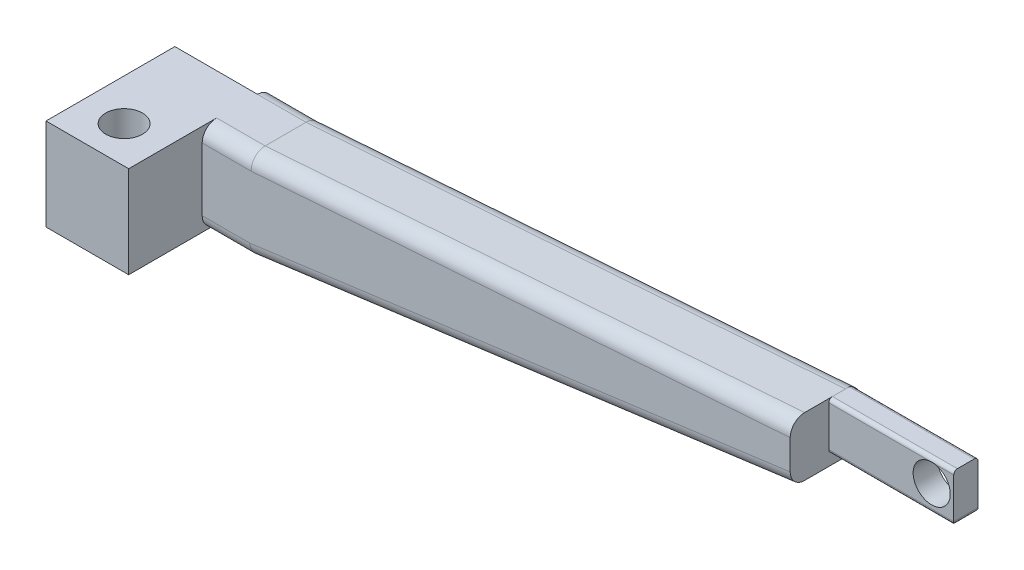
ISO-10303-21;
HEADER;
FILE_DESCRIPTION(('STEP AP214'),'2;1');
FILE_NAME('part.step','',(''),(''),'','','');
FILE_SCHEMA(('AUTOMOTIVE_DESIGN { 1 0 10303 214 1 1 1 1 }'));
ENDSEC;
DATA;
#1=APPLICATION_CONTEXT('core data for automotive mechanical design processes');
#2=APPLICATION_PROTOCOL_DEFINITION('international standard','automotive_design',2000,#1);
#3=PRODUCT_CONTEXT('',#1,'mechanical');
#4=PRODUCT('Part','Part','',(#3));
#5=PRODUCT_RELATED_PRODUCT_CATEGORY('part','',(#4));
#6=PRODUCT_DEFINITION_FORMATION('','',#4);
#7=PRODUCT_DEFINITION_CONTEXT('part definition',#1,'design');
#8=PRODUCT_DEFINITION('design','',#6,#7);
#9=PRODUCT_DEFINITION_SHAPE('','',#8);
#10=(LENGTH_UNIT() NAMED_UNIT(*) SI_UNIT(.MILLI.,.METRE.));
#11=(NAMED_UNIT(*) PLANE_ANGLE_UNIT() SI_UNIT($,.RADIAN.));
#12=(NAMED_UNIT(*) SI_UNIT($,.STERADIAN.) SOLID_ANGLE_UNIT());
#13=UNCERTAINTY_MEASURE_WITH_UNIT(LENGTH_MEASURE(1.E-05),#10,'distance_accuracy_value','');
#14=(GEOMETRIC_REPRESENTATION_CONTEXT(3) GLOBAL_UNCERTAINTY_ASSIGNED_CONTEXT((#13)) GLOBAL_UNIT_ASSIGNED_CONTEXT((#10,
#11,#12)) REPRESENTATION_CONTEXT('',''));
#15=CARTESIAN_POINT('',(0.,0.,0.));
#16=DIRECTION('',(0.,0.,1.));
#17=DIRECTION('',(1.,0.,0.));
#18=AXIS2_PLACEMENT_3D('',#15,#16,#17);
#19=CARTESIAN_POINT('',(406.4,-11.246281292,50.8));
#20=DIRECTION('',(-1.,0.,0.));
#21=DIRECTION('',(0.,0.,1.));
#22=AXIS2_PLACEMENT_3D('',#19,#20,#21);
#23=PLANE('',#22);
#24=DIRECTION('',(0.,-1.,0.));
#25=VECTOR('',#24,1.);
#26=CARTESIAN_POINT('',(406.4,90.353718708,72.39));
#27=LINE('',#26,#25);
#28=CARTESIAN_POINT('',(406.4,87.813718708,72.39));
#29=VERTEX_POINT('',#28);
#30=CARTESIAN_POINT('',(406.4,59.873718708,72.39));
#31=VERTEX_POINT('',#30);
#32=EDGE_CURVE('E488',#29,#31,#27,.T.);
#33=ORIENTED_EDGE('',*,*,#32,.F.);
#34=CARTESIAN_POINT('',(406.4,87.813718708,69.85));
#35=DIRECTION('',(-1.,0.,0.));
#36=DIRECTION('',(0.,0.,1.));
#37=AXIS2_PLACEMENT_3D('',#34,#35,#36);
#38=CIRCLE('',#37,2.54);
#39=CARTESIAN_POINT('',(406.4,90.353718708,69.85));
#40=VERTEX_POINT('',#39);
#41=EDGE_CURVE('E174',#29,#40,#38,.T.);
#42=ORIENTED_EDGE('',*,*,#41,.T.);
#43=DIRECTION('',(0.,0.,-1.));
#44=VECTOR('',#43,1.);
#45=CARTESIAN_POINT('',(406.4,90.353718708,99.06));
#46=LINE('',#45,#44);
#47=CARTESIAN_POINT('',(406.4,90.353718708,89.06));
#48=VERTEX_POINT('',#47);
#49=EDGE_CURVE('E182',#48,#40,#46,.T.);
#50=ORIENTED_EDGE('',*,*,#49,.F.);
#51=CARTESIAN_POINT('',(406.4,80.3278225001821,89.06));
#52=DIRECTION('',(-1.,0.,0.));
#53=DIRECTION('',(0.,1.,0.));
#54=AXIS2_PLACEMENT_3D('',#51,#52,#53);
#55=ELLIPSE('',#54,10.0258962078179,10.);
#56=CARTESIAN_POINT('',(406.4,80.3278225001821,99.06));
#57=VERTEX_POINT('',#56);
#58=EDGE_CURVE('E667',#48,#57,#55,.F.);
#59=ORIENTED_EDGE('',*,*,#58,.T.);
#60=DIRECTION('',(0.,-1.,0.));
#61=VECTOR('',#60,1.);
#62=CARTESIAN_POINT('',(406.4,0.,99.06));
#63=LINE('',#62,#61);
#64=CARTESIAN_POINT('',(406.4,59.8021945645248,99.06));
#65=VERTEX_POINT('',#64);
#66=EDGE_CURVE('E593',#57,#65,#63,.T.);
#67=ORIENTED_EDGE('',*,*,#66,.T.);
#68=CARTESIAN_POINT('',(406.4,59.8021945645248,89.06));
#69=DIRECTION('',(-1.,0.,0.));
#70=DIRECTION('',(0.,-1.,0.));
#71=AXIS2_PLACEMENT_3D('',#68,#69,#70);
#72=ELLIPSE('',#71,10.0884758565248,10.);
#73=CARTESIAN_POINT('',(406.4,49.713718708,89.06));
#74=VERTEX_POINT('',#73);
#75=EDGE_CURVE('E663',#65,#74,#72,.F.);
#76=ORIENTED_EDGE('',*,*,#75,.T.);
#77=DIRECTION('',(0.,0.,1.));
#78=VECTOR('',#77,1.);
#79=CARTESIAN_POINT('',(406.4,49.713718708,99.06));
#80=LINE('',#79,#78);
#81=CARTESIAN_POINT('',(406.4,49.713718708,60.8));
#82=VERTEX_POINT('',#81);
#83=EDGE_CURVE('E565',#82,#74,#80,.T.);
#84=ORIENTED_EDGE('',*,*,#83,.F.);
#85=CARTESIAN_POINT('',(406.4,59.8021945645248,60.8));
#86=DIRECTION('',(-1.,0.,0.));
#87=DIRECTION('',(0.,1.,0.));
#88=AXIS2_PLACEMENT_3D('',#85,#86,#87);
#89=ELLIPSE('',#88,10.0884758565248,10.);
#90=CARTESIAN_POINT('',(406.4,59.8021945645248,50.8));
#91=VERTEX_POINT('',#90);
#92=EDGE_CURVE('E628',#82,#91,#89,.F.);
#93=ORIENTED_EDGE('',*,*,#92,.T.);
#94=DIRECTION('',(0.,-1.,0.));
#95=VECTOR('',#94,1.);
#96=CARTESIAN_POINT('',(406.4,0.,50.8));
#97=LINE('',#96,#95);
#98=CARTESIAN_POINT('',(406.4,80.3278225001821,50.8));
#99=VERTEX_POINT('',#98);
#100=EDGE_CURVE('E586',#99,#91,#97,.T.);
#101=ORIENTED_EDGE('',*,*,#100,.F.);
#102=CARTESIAN_POINT('',(406.4,80.3278225001821,60.8));
#103=DIRECTION('',(-1.,0.,0.));
#104=DIRECTION('',(0.,-1.,0.));
#105=AXIS2_PLACEMENT_3D('',#102,#103,#104);
#106=ELLIPSE('',#105,10.0258962078179,10.);
#107=CARTESIAN_POINT('',(406.4,89.114687054896,55.9844681161223));
#108=VERTEX_POINT('',#107);
#109=EDGE_CURVE('E202',#99,#108,#106,.F.);
#110=ORIENTED_EDGE('',*,*,#109,.T.);
#111=CARTESIAN_POINT('',(406.4,87.813718708,58.166));
#112=DIRECTION('',(-1.,0.,0.));
#113=DIRECTION('',(0.,0.,1.));
#114=AXIS2_PLACEMENT_3D('',#111,#112,#113);
#115=CIRCLE('',#114,2.54);
#116=CARTESIAN_POINT('',(406.4,87.813718708,55.626));
#117=VERTEX_POINT('',#116);
#118=EDGE_CURVE('E455',#108,#117,#115,.T.);
#119=ORIENTED_EDGE('',*,*,#118,.T.);
#120=DIRECTION('',(0.,1.,0.));
#121=VECTOR('',#120,1.);
#122=CARTESIAN_POINT('',(406.4,90.353718708,55.626));
#123=LINE('',#122,#121);
#124=CARTESIAN_POINT('',(406.4,59.873718708,55.626));
#125=VERTEX_POINT('',#124);
#126=EDGE_CURVE('E252',#125,#117,#123,.T.);
#127=ORIENTED_EDGE('',*,*,#126,.F.);
#128=CARTESIAN_POINT('',(406.4,59.873718708,58.166));
#129=DIRECTION('',(-1.,0.,0.));
#130=DIRECTION('',(0.,0.,1.));
#131=AXIS2_PLACEMENT_3D('',#128,#129,#130);
#132=CIRCLE('',#131,2.54);
#133=CARTESIAN_POINT('',(406.4,57.333718708,58.166));
#134=VERTEX_POINT('',#133);
#135=EDGE_CURVE('E242',#125,#134,#132,.T.);
#136=ORIENTED_EDGE('',*,*,#135,.T.);
#137=DIRECTION('',(0.,0.,-1.));
#138=VECTOR('',#137,1.);
#139=CARTESIAN_POINT('',(406.4,57.333718708,55.626));
#140=LINE('',#139,#138);
#141=CARTESIAN_POINT('',(406.4,57.333718708,69.85));
#142=VERTEX_POINT('',#141);
#143=EDGE_CURVE('E481',#142,#134,#140,.T.);
#144=ORIENTED_EDGE('',*,*,#143,.F.);
#145=CARTESIAN_POINT('',(406.4,59.873718708,69.85));
#146=DIRECTION('',(-1.,0.,0.));
#147=DIRECTION('',(0.,0.,1.));
#148=AXIS2_PLACEMENT_3D('',#145,#146,#147);
#149=CIRCLE('',#148,2.54);
#150=EDGE_CURVE('E12',#142,#31,#149,.T.);
#151=ORIENTED_EDGE('',*,*,#150,.T.);
#152=EDGE_LOOP('',(#33,#42,#50,#59,#67,#76,#84,#93,#101,#110,#119,#127,#136,#144,#151));
#153=FACE_BOUND('',#152,.T.);
#154=ADVANCED_FACE('F163',(#153),#23,.F.);
#155=CARTESIAN_POINT('',(0.,63.5,50.8));
#156=DIRECTION('',(0.,-1.,0.));
#157=DIRECTION('',(1.,0.,0.));
#158=AXIS2_PLACEMENT_3D('',#155,#156,#157);
#159=PLANE('',#158);
#160=DIRECTION('',(-1.,0.,0.));
#161=VECTOR('',#160,1.);
#162=CARTESIAN_POINT('',(0.,63.5,60.8));
#163=LINE('',#162,#161);
#164=CARTESIAN_POINT('',(33.5017295109887,63.5,60.8));
#165=VERTEX_POINT('',#164);
#166=CARTESIAN_POINT('',(0.,63.5,60.8));
#167=VERTEX_POINT('',#166);
#168=EDGE_CURVE('E601',#165,#167,#163,.T.);
#169=ORIENTED_EDGE('',*,*,#168,.T.);
#170=DIRECTION('',(1.,0.,0.));
#171=VECTOR('',#170,1.);
#172=CARTESIAN_POINT('',(0.,63.5,60.8));
#173=LINE('',#172,#171);
#174=CARTESIAN_POINT('',(-57.15,63.5,60.8));
#175=VERTEX_POINT('',#174);
#176=EDGE_CURVE('E493',#175,#167,#173,.T.);
#177=ORIENTED_EDGE('',*,*,#176,.F.);
#178=DIRECTION('',(0.,0.,-1.));
#179=VECTOR('',#178,1.);
#180=CARTESIAN_POINT('',(-57.15,63.5,50.8));
#181=LINE('',#180,#179);
#182=CARTESIAN_POINT('',(-57.15,63.5,149.86));
#183=VERTEX_POINT('',#182);
#184=EDGE_CURVE('E582',#183,#175,#181,.T.);
#185=ORIENTED_EDGE('',*,*,#184,.F.);
#186=DIRECTION('',(1.,0.,0.));
#187=VECTOR('',#186,1.);
#188=CARTESIAN_POINT('',(-57.15,63.5,149.86));
#189=LINE('',#188,#187);
#190=CARTESIAN_POINT('',(0.,63.5,149.86));
#191=VERTEX_POINT('',#190);
#192=EDGE_CURVE('E535',#183,#191,#189,.T.);
#193=ORIENTED_EDGE('',*,*,#192,.T.);
#194=DIRECTION('',(0.,0.,-1.));
#195=VECTOR('',#194,1.);
#196=CARTESIAN_POINT('',(0.,63.5,50.8));
#197=LINE('',#196,#195);
#198=CARTESIAN_POINT('',(0.,63.5,89.06));
#199=VERTEX_POINT('',#198);
#200=EDGE_CURVE('E526',#191,#199,#197,.T.);
#201=ORIENTED_EDGE('',*,*,#200,.T.);
#202=DIRECTION('',(-1.,0.,0.));
#203=VECTOR('',#202,1.);
#204=CARTESIAN_POINT('',(33.5017295109887,63.5,89.06));
#205=LINE('',#204,#203);
#206=CARTESIAN_POINT('',(33.5017295109887,63.5,89.06));
#207=VERTEX_POINT('',#206);
#208=EDGE_CURVE('E597',#199,#207,#205,.F.);
#209=ORIENTED_EDGE('',*,*,#208,.T.);
#210=DIRECTION('',(0.,0.,-1.));
#211=VECTOR('',#210,1.);
#212=CARTESIAN_POINT('',(33.5017295109887,63.5,99.06));
#213=LINE('',#212,#211);
#214=EDGE_CURVE('E567',#207,#165,#213,.T.);
#215=ORIENTED_EDGE('',*,*,#214,.T.);
#216=EDGE_LOOP('',(#169,#177,#185,#193,#201,#209,#215));
#217=FACE_BOUND('',#216,.T.);
#218=CARTESIAN_POINT('',(-28.575,63.5,124.46));
#219=DIRECTION('',(0.,1.,0.));
#220=DIRECTION('',(-1.,0.,0.));
#221=AXIS2_PLACEMENT_3D('',#218,#219,#220);
#222=CIRCLE('',#221,12.7);
#223=CARTESIAN_POINT('',(-41.275,63.5,124.46));
#224=VERTEX_POINT('',#223);
#225=EDGE_CURVE('E521',#224,#224,#222,.T.);
#226=ORIENTED_EDGE('',*,*,#225,.F.);
#227=EDGE_LOOP('',(#226));
#228=FACE_BOUND('',#227,.T.);
#229=ADVANCED_FACE('F365',(#217,#228),#159,.F.);
#230=CARTESIAN_POINT('',(-57.15,0.,50.8));
#231=DIRECTION('',(1.,0.,0.));
#232=DIRECTION('',(0.,0.,-1.));
#233=AXIS2_PLACEMENT_3D('',#230,#231,#232);
#234=PLANE('',#233);
#235=ORIENTED_EDGE('',*,*,#184,.T.);
#236=DIRECTION('',(0.,-1.,0.));
#237=VECTOR('',#236,1.);
#238=CARTESIAN_POINT('',(-57.15,0.,60.8));
#239=LINE('',#238,#237);
#240=CARTESIAN_POINT('',(-57.15,0.,60.8));
#241=VERTEX_POINT('',#240);
#242=EDGE_CURVE('E517',#175,#241,#239,.T.);
#243=ORIENTED_EDGE('',*,*,#242,.T.);
#244=DIRECTION('',(0.,0.,-1.));
#245=VECTOR('',#244,1.);
#246=CARTESIAN_POINT('',(-57.15,0.,50.8));
#247=LINE('',#246,#245);
#248=CARTESIAN_POINT('',(-57.15,0.,149.86));
#249=VERTEX_POINT('',#248);
#250=EDGE_CURVE('E578',#249,#241,#247,.T.);
#251=ORIENTED_EDGE('',*,*,#250,.F.);
#252=DIRECTION('',(0.,1.,0.));
#253=VECTOR('',#252,1.);
#254=CARTESIAN_POINT('',(-57.15,0.,149.86));
#255=LINE('',#254,#253);
#256=EDGE_CURVE('E539',#249,#183,#255,.T.);
#257=ORIENTED_EDGE('',*,*,#256,.T.);
#258=EDGE_LOOP('',(#235,#243,#251,#257));
#259=FACE_BOUND('',#258,.T.);
#260=ADVANCED_FACE('F385',(#259),#234,.F.);
#261=CARTESIAN_POINT('',(0.,0.,50.8));
#262=DIRECTION('',(0.,1.,0.));
#263=DIRECTION('',(-1.,0.,0.));
#264=AXIS2_PLACEMENT_3D('',#261,#262,#263);
#265=PLANE('',#264);
#266=DIRECTION('',(1.,0.,0.));
#267=VECTOR('',#266,1.);
#268=CARTESIAN_POINT('',(0.,0.,60.8));
#269=LINE('',#268,#267);
#270=CARTESIAN_POINT('',(0.,0.,60.8));
#271=VERTEX_POINT('',#270);
#272=EDGE_CURVE('E506',#241,#271,#269,.T.);
#273=ORIENTED_EDGE('',*,*,#272,.T.);
#274=DIRECTION('',(0.,0.,-1.));
#275=VECTOR('',#274,1.);
#276=CARTESIAN_POINT('',(0.,0.,60.8));
#277=LINE('',#276,#275);
#278=CARTESIAN_POINT('',(0.,0.,52.4967645251728));
#279=VERTEX_POINT('',#278);
#280=EDGE_CURVE('E502',#271,#279,#277,.T.);
#281=ORIENTED_EDGE('',*,*,#280,.T.);
#282=CARTESIAN_POINT('',(-42.1710484774112,0.,60.8));
#283=DIRECTION('',(0.,1.,0.));
#284=DIRECTION('',(1.,0.,0.));
#285=AXIS2_PLACEMENT_3D('',#282,#283,#284);
#286=ELLIPSE('',#285,75.6727779884,10.);
#287=CARTESIAN_POINT('',(33.5017295109887,0.,60.8));
#288=VERTEX_POINT('',#287);
#289=EDGE_CURVE('E636',#279,#288,#286,.F.);
#290=ORIENTED_EDGE('',*,*,#289,.T.);
#291=DIRECTION('',(0.,0.,-1.));
#292=VECTOR('',#291,1.);
#293=CARTESIAN_POINT('',(33.5017295109887,0.,99.06));
#294=LINE('',#293,#292);
#295=CARTESIAN_POINT('',(33.5017295109887,0.,89.06));
#296=VERTEX_POINT('',#295);
#297=EDGE_CURVE('E573',#296,#288,#294,.T.);
#298=ORIENTED_EDGE('',*,*,#297,.F.);
#299=DIRECTION('',(1.,0.,0.));
#300=VECTOR('',#299,1.);
#301=CARTESIAN_POINT('',(-57.15,0.,89.06));
#302=LINE('',#301,#300);
#303=CARTESIAN_POINT('',(0.,0.,89.06));
#304=VERTEX_POINT('',#303);
#305=EDGE_CURVE('E632',#296,#304,#302,.F.);
#306=ORIENTED_EDGE('',*,*,#305,.T.);
#307=DIRECTION('',(0.,0.,-1.));
#308=VECTOR('',#307,1.);
#309=CARTESIAN_POINT('',(0.,0.,50.8));
#310=LINE('',#309,#308);
#311=CARTESIAN_POINT('',(0.,0.,149.86));
#312=VERTEX_POINT('',#311);
#313=EDGE_CURVE('E530',#312,#304,#310,.T.);
#314=ORIENTED_EDGE('',*,*,#313,.F.);
#315=DIRECTION('',(1.,0.,0.));
#316=VECTOR('',#315,1.);
#317=CARTESIAN_POINT('',(-57.15,0.,149.86));
#318=LINE('',#317,#316);
#319=EDGE_CURVE('E534',#249,#312,#318,.T.);
#320=ORIENTED_EDGE('',*,*,#319,.F.);
#321=ORIENTED_EDGE('',*,*,#250,.T.);
#322=EDGE_LOOP('',(#273,#281,#290,#298,#306,#314,#320,#321));
#323=FACE_BOUND('',#322,.T.);
#324=CARTESIAN_POINT('',(-28.575,0.,124.46));
#325=DIRECTION('',(0.,1.,0.));
#326=DIRECTION('',(-1.,0.,0.));
#327=AXIS2_PLACEMENT_3D('',#324,#325,#326);
#328=CIRCLE('',#327,12.7);
#329=CARTESIAN_POINT('',(-41.275,0.,124.46));
#330=VERTEX_POINT('',#329);
#331=EDGE_CURVE('E522',#330,#330,#328,.T.);
#332=ORIENTED_EDGE('',*,*,#331,.T.);
#333=EDGE_LOOP('',(#332));
#334=FACE_BOUND('',#333,.T.);
#335=ADVANCED_FACE('F381',(#323,#334),#265,.F.);
#336=CARTESIAN_POINT('',(33.5017295109887,0.,99.06));
#337=DIRECTION('',(-0.132147917201255,0.991230007606393,0.));
#338=DIRECTION('',(-0.991230007606393,-0.132147917201255,0.));
#339=AXIS2_PLACEMENT_3D('',#336,#337,#338);
#340=PLANE('',#339);
#341=ORIENTED_EDGE('',*,*,#297,.T.);
#342=DIRECTION('',(0.991230007606393,0.132147917201255,0.));
#343=VECTOR('',#342,1.);
#344=CARTESIAN_POINT('',(33.5017295109887,0.,60.8));
#345=LINE('',#344,#343);
#346=EDGE_CURVE('E621',#288,#82,#345,.T.);
#347=ORIENTED_EDGE('',*,*,#346,.T.);
#348=ORIENTED_EDGE('',*,*,#83,.T.);
#349=DIRECTION('',(0.991230007606393,0.132147917201255,0.));
#350=VECTOR('',#349,1.);
#351=CARTESIAN_POINT('',(33.5017295109887,0.,89.06));
#352=LINE('',#351,#350);
#353=EDGE_CURVE('E617',#74,#296,#352,.F.);
#354=ORIENTED_EDGE('',*,*,#353,.T.);
#355=EDGE_LOOP('',(#341,#347,#348,#354));
#356=FACE_BOUND('',#355,.T.);
#357=ADVANCED_FACE('F378',(#356),#340,.F.);
#358=CARTESIAN_POINT('',(33.5017295109887,63.5,99.06));
#359=DIRECTION('',(0.0718275183855872,-0.99741706803251,0.));
#360=DIRECTION('',(0.99741706803251,0.0718275183855872,0.));
#361=AXIS2_PLACEMENT_3D('',#358,#359,#360);
#362=PLANE('',#361);
#363=DIRECTION('',(0.,0.,1.));
#364=VECTOR('',#363,1.);
#365=CARTESIAN_POINT('',(406.4,90.353718708,50.8));
#366=LINE('',#365,#364);
#367=CARTESIAN_POINT('',(406.4,90.353718708,60.8));
#368=VERTEX_POINT('',#367);
#369=EDGE_CURVE('E562',#368,#40,#366,.T.);
#370=ORIENTED_EDGE('',*,*,#369,.F.);
#371=DIRECTION('',(-0.99741706803251,-0.0718275183855872,0.));
#372=VECTOR('',#371,1.);
#373=CARTESIAN_POINT('',(33.5017295109887,63.5,60.8));
#374=LINE('',#373,#372);
#375=EDGE_CURVE('E643',#368,#165,#374,.T.);
#376=ORIENTED_EDGE('',*,*,#375,.T.);
#377=ORIENTED_EDGE('',*,*,#214,.F.);
#378=DIRECTION('',(-0.99741706803251,-0.0718275183855872,0.));
#379=VECTOR('',#378,1.);
#380=CARTESIAN_POINT('',(406.4,90.353718708,89.06));
#381=LINE('',#380,#379);
#382=EDGE_CURVE('E640',#207,#48,#381,.F.);
#383=ORIENTED_EDGE('',*,*,#382,.T.);
#384=ORIENTED_EDGE('',*,*,#49,.T.);
#385=EDGE_LOOP('',(#370,#376,#377,#383,#384));
#386=FACE_BOUND('',#385,.T.);
#387=ADVANCED_FACE('F370',(#386),#362,.F.);
#388=CARTESIAN_POINT('',(0.,0.,99.06));
#389=DIRECTION('',(0.,0.,1.));
#390=DIRECTION('',(1.,0.,0.));
#391=AXIS2_PLACEMENT_3D('',#388,#389,#390);
#392=PLANE('',#391);
#393=DIRECTION('',(0.,1.,0.));
#394=VECTOR('',#393,1.);
#395=CARTESIAN_POINT('',(0.,0.,99.06));
#396=LINE('',#395,#394);
#397=CARTESIAN_POINT('',(0.,10.,99.06));
#398=VERTEX_POINT('',#397);
#399=CARTESIAN_POINT('',(0.,53.5,99.06));
#400=VERTEX_POINT('',#399);
#401=EDGE_CURVE('E550',#398,#400,#396,.T.);
#402=ORIENTED_EDGE('',*,*,#401,.F.);
#403=DIRECTION('',(1.,0.,0.));
#404=VECTOR('',#403,1.);
#405=CARTESIAN_POINT('',(33.5017295109887,10.,99.06));
#406=LINE('',#405,#404);
#407=CARTESIAN_POINT('',(32.8380798236274,10.,99.06));
#408=VERTEX_POINT('',#407);
#409=EDGE_CURVE('E655',#398,#408,#406,.T.);
#410=ORIENTED_EDGE('',*,*,#409,.T.);
#411=DIRECTION('',(0.991230007606393,0.132147917201255,0.));
#412=VECTOR('',#411,1.);
#413=CARTESIAN_POINT('',(405.078520827988,59.626018784064,99.06));
#414=LINE('',#413,#412);
#415=EDGE_CURVE('E659',#408,#65,#414,.T.);
#416=ORIENTED_EDGE('',*,*,#415,.T.);
#417=ORIENTED_EDGE('',*,*,#66,.F.);
#418=DIRECTION('',(-0.99741706803251,-0.0718275183855872,0.));
#419=VECTOR('',#418,1.);
#420=CARTESIAN_POINT('',(34.2200046948446,53.5258293196749,99.06));
#421=LINE('',#420,#419);
#422=CARTESIAN_POINT('',(33.8613315166746,53.5,99.06));
#423=VERTEX_POINT('',#422);
#424=EDGE_CURVE('E651',#57,#423,#421,.T.);
#425=ORIENTED_EDGE('',*,*,#424,.T.);
#426=DIRECTION('',(-1.,0.,0.));
#427=VECTOR('',#426,1.);
#428=CARTESIAN_POINT('',(-57.15,53.5,99.06));
#429=LINE('',#428,#427);
#430=EDGE_CURVE('E647',#423,#400,#429,.T.);
#431=ORIENTED_EDGE('',*,*,#430,.T.);
#432=EDGE_LOOP('',(#402,#410,#416,#417,#425,#431));
#433=FACE_BOUND('',#432,.T.);
#434=ADVANCED_FACE('F366',(#433),#392,.T.);
#435=CARTESIAN_POINT('',(0.,0.,50.8));
#436=DIRECTION('',(0.,0.,1.));
#437=DIRECTION('',(1.,0.,0.));
#438=AXIS2_PLACEMENT_3D('',#435,#436,#437);
#439=PLANE('',#438);
#440=ORIENTED_EDGE('',*,*,#100,.T.);
#441=DIRECTION('',(0.991230007606393,0.132147917201255,0.));
#442=VECTOR('',#441,1.);
#443=CARTESIAN_POINT('',(-0.736436056746496,5.52394266660088,50.8));
#444=LINE('',#443,#442);
#445=CARTESIAN_POINT('',(0.,5.62212219133698,50.8));
#446=VERTEX_POINT('',#445);
#447=EDGE_CURVE('E613',#91,#446,#444,.F.);
#448=ORIENTED_EDGE('',*,*,#447,.T.);
#449=DIRECTION('',(0.,1.,0.));
#450=VECTOR('',#449,1.);
#451=CARTESIAN_POINT('',(0.,0.,50.8));
#452=LINE('',#451,#450);
#453=CARTESIAN_POINT('',(0.,53.5,50.8));
#454=VERTEX_POINT('',#453);
#455=EDGE_CURVE('E577',#446,#454,#452,.T.);
#456=ORIENTED_EDGE('',*,*,#455,.T.);
#457=DIRECTION('',(-1.,0.,0.));
#458=VECTOR('',#457,1.);
#459=CARTESIAN_POINT('',(0.,53.5,50.8));
#460=LINE('',#459,#458);
#461=CARTESIAN_POINT('',(33.8613315166747,53.5,50.8));
#462=VERTEX_POINT('',#461);
#463=EDGE_CURVE('E609',#454,#462,#460,.F.);
#464=ORIENTED_EDGE('',*,*,#463,.T.);
#465=DIRECTION('',(-0.99741706803251,-0.0718275183855872,0.));
#466=VECTOR('',#465,1.);
#467=CARTESIAN_POINT('',(-3.65814949025514,50.7980899382854,50.8));
#468=LINE('',#467,#466);
#469=EDGE_CURVE('E605',#462,#99,#468,.F.);
#470=ORIENTED_EDGE('',*,*,#469,.T.);
#471=EDGE_LOOP('',(#440,#448,#456,#464,#470));
#472=FACE_BOUND('',#471,.T.);
#473=ADVANCED_FACE('F369',(#472),#439,.F.);
#474=CARTESIAN_POINT('',(34.2200046948446,53.5258293196749,60.8));
#475=DIRECTION('',(-0.99741706803251,-0.0718275183855872,0.));
#476=DIRECTION('',(0.0718275183855872,-0.99741706803251,0.));
#477=AXIS2_PLACEMENT_3D('',#474,#475,#476);
#478=CYLINDRICAL_SURFACE('',#477,10.);
#479=ORIENTED_EDGE('',*,*,#109,.F.);
#480=ORIENTED_EDGE('',*,*,#469,.F.);
#481=CARTESIAN_POINT('',(33.8613315166738,53.5,60.8));
#482=DIRECTION('',(-0.999354058387844,-0.0359369723786677,0.));
#483=DIRECTION('',(-0.0359369723786676,0.999354058387844,0.));
#484=AXIS2_PLACEMENT_3D('',#481,#482,#483);
#485=ELLIPSE('',#484,10.0064635912241,10.);
#486=EDGE_CURVE('E566',#165,#462,#485,.T.);
#487=ORIENTED_EDGE('',*,*,#486,.F.);
#488=ORIENTED_EDGE('',*,*,#375,.F.);
#489=EDGE_CURVE('E625',#108,#368,#106,.F.);
#490=ORIENTED_EDGE('',*,*,#489,.F.);
#491=EDGE_LOOP('',(#479,#480,#487,#488,#490));
#492=FACE_BOUND('',#491,.T.);
#493=ADVANCED_FACE('F374',(#492),#478,.T.);
#494=CARTESIAN_POINT('',(0.,53.5,60.8));
#495=DIRECTION('',(-1.,0.,0.));
#496=DIRECTION('',(0.,-1.,0.));
#497=AXIS2_PLACEMENT_3D('',#494,#495,#496);
#498=CYLINDRICAL_SURFACE('',#497,10.);
#499=ORIENTED_EDGE('',*,*,#486,.T.);
#500=ORIENTED_EDGE('',*,*,#463,.F.);
#501=CARTESIAN_POINT('',(0.,53.5,60.8));
#502=DIRECTION('',(1.,0.,0.));
#503=DIRECTION('',(0.,1.,0.));
#504=AXIS2_PLACEMENT_3D('',#501,#502,#503);
#505=CIRCLE('',#504,10.);
#506=EDGE_CURVE('E671',#167,#454,#505,.F.);
#507=ORIENTED_EDGE('',*,*,#506,.F.);
#508=ORIENTED_EDGE('',*,*,#168,.F.);
#509=EDGE_LOOP('',(#499,#500,#507,#508));
#510=FACE_BOUND('',#509,.T.);
#511=ADVANCED_FACE('F393',(#510),#498,.T.);
#512=CARTESIAN_POINT('',(32.1802503389762,9.91230007606393,60.8));
#513=DIRECTION('',(0.991230007606393,0.132147917201255,0.));
#514=DIRECTION('',(-0.132147917201255,0.991230007606393,0.));
#515=AXIS2_PLACEMENT_3D('',#512,#513,#514);
#516=CYLINDRICAL_SURFACE('',#515,10.);
#517=CARTESIAN_POINT('',(0.,5.62212219133698,60.8));
#518=DIRECTION('',(1.,0.,0.));
#519=DIRECTION('',(0.,1.,0.));
#520=AXIS2_PLACEMENT_3D('',#517,#518,#519);
#521=ELLIPSE('',#520,10.0884758565248,10.);
#522=EDGE_CURVE('E675',#446,#279,#521,.F.);
#523=ORIENTED_EDGE('',*,*,#522,.F.);
#524=ORIENTED_EDGE('',*,*,#447,.F.);
#525=ORIENTED_EDGE('',*,*,#92,.F.);
#526=ORIENTED_EDGE('',*,*,#346,.F.);
#527=ORIENTED_EDGE('',*,*,#289,.F.);
#528=EDGE_LOOP('',(#523,#524,#525,#526,#527));
#529=FACE_BOUND('',#528,.T.);
#530=ADVANCED_FACE('F396',(#529),#516,.T.);
#531=CARTESIAN_POINT('',(0.,53.5,89.06));
#532=DIRECTION('',(1.,0.,0.));
#533=DIRECTION('',(0.,1.,0.));
#534=AXIS2_PLACEMENT_3D('',#531,#532,#533);
#535=CYLINDRICAL_SURFACE('',#534,10.);
#536=CARTESIAN_POINT('',(0.,53.5,89.06));
#537=DIRECTION('',(1.,0.,0.));
#538=DIRECTION('',(0.,1.,0.));
#539=AXIS2_PLACEMENT_3D('',#536,#537,#538);
#540=CIRCLE('',#539,10.);
#541=EDGE_CURVE('E557',#400,#199,#540,.F.);
#542=ORIENTED_EDGE('',*,*,#541,.F.);
#543=ORIENTED_EDGE('',*,*,#430,.F.);
#544=CARTESIAN_POINT('',(33.8613315166747,53.5,89.06));
#545=DIRECTION('',(0.999354058387844,0.0359369723786677,0.));
#546=DIRECTION('',(-0.0359369723786676,0.999354058387844,0.));
#547=AXIS2_PLACEMENT_3D('',#544,#545,#546);
#548=ELLIPSE('',#547,10.0064635912241,10.);
#549=EDGE_CURVE('E682',#207,#423,#548,.T.);
#550=ORIENTED_EDGE('',*,*,#549,.F.);
#551=ORIENTED_EDGE('',*,*,#208,.F.);
#552=EDGE_LOOP('',(#542,#543,#550,#551));
#553=FACE_BOUND('',#552,.T.);
#554=ADVANCED_FACE('F403',(#553),#535,.T.);
#555=CARTESIAN_POINT('',(-3.65814949025514,50.7980899382854,89.06));
#556=DIRECTION('',(0.99741706803251,0.0718275183855872,0.));
#557=DIRECTION('',(-0.0718275183855872,0.99741706803251,0.));
#558=AXIS2_PLACEMENT_3D('',#555,#556,#557);
#559=CYLINDRICAL_SURFACE('',#558,10.);
#560=ORIENTED_EDGE('',*,*,#58,.F.);
#561=ORIENTED_EDGE('',*,*,#382,.F.);
#562=ORIENTED_EDGE('',*,*,#549,.T.);
#563=ORIENTED_EDGE('',*,*,#424,.F.);
#564=EDGE_LOOP('',(#560,#561,#562,#563));
#565=FACE_BOUND('',#564,.T.);
#566=ADVANCED_FACE('F405',(#565),#559,.T.);
#567=CARTESIAN_POINT('',(0.,10.,89.06));
#568=DIRECTION('',(-1.,0.,0.));
#569=DIRECTION('',(0.,-1.,0.));
#570=AXIS2_PLACEMENT_3D('',#567,#568,#569);
#571=CYLINDRICAL_SURFACE('',#570,10.);
#572=CARTESIAN_POINT('',(0.,10.,89.06));
#573=DIRECTION('',(1.,0.,0.));
#574=DIRECTION('',(0.,1.,0.));
#575=AXIS2_PLACEMENT_3D('',#572,#573,#574);
#576=CIRCLE('',#575,10.);
#577=EDGE_CURVE('E258',#304,#398,#576,.F.);
#578=ORIENTED_EDGE('',*,*,#577,.F.);
#579=ORIENTED_EDGE('',*,*,#305,.F.);
#580=CARTESIAN_POINT('',(32.8380798236274,10.,89.06));
#581=DIRECTION('',(-0.997805093093434,-0.0662193038079034,0.));
#582=DIRECTION('',(-0.0662193038079032,0.997805093093434,0.));
#583=AXIS2_PLACEMENT_3D('',#580,#581,#582);
#584=ELLIPSE('',#583,10.0219973512037,10.);
#585=EDGE_CURVE('E561',#408,#296,#584,.F.);
#586=ORIENTED_EDGE('',*,*,#585,.F.);
#587=ORIENTED_EDGE('',*,*,#409,.F.);
#588=EDGE_LOOP('',(#578,#579,#586,#587));
#589=FACE_BOUND('',#588,.T.);
#590=ADVANCED_FACE('F408',(#589),#571,.T.);
#591=CARTESIAN_POINT('',(-0.736436056746496,5.52394266660088,89.06));
#592=DIRECTION('',(-0.991230007606393,-0.132147917201255,0.));
#593=DIRECTION('',(0.132147917201255,-0.991230007606393,0.));
#594=AXIS2_PLACEMENT_3D('',#591,#592,#593);
#595=CYLINDRICAL_SURFACE('',#594,10.);
#596=ORIENTED_EDGE('',*,*,#585,.T.);
#597=ORIENTED_EDGE('',*,*,#353,.F.);
#598=ORIENTED_EDGE('',*,*,#75,.F.);
#599=ORIENTED_EDGE('',*,*,#415,.F.);
#600=EDGE_LOOP('',(#596,#597,#598,#599));
#601=FACE_BOUND('',#600,.T.);
#602=ADVANCED_FACE('F361',(#601),#595,.T.);
#603=CARTESIAN_POINT('',(0.,0.,50.8));
#604=DIRECTION('',(1.,0.,0.));
#605=DIRECTION('',(0.,1.,0.));
#606=AXIS2_PLACEMENT_3D('',#603,#604,#605);
#607=PLANE('',#606);
#608=ORIENTED_EDGE('',*,*,#401,.T.);
#609=ORIENTED_EDGE('',*,*,#541,.T.);
#610=ORIENTED_EDGE('',*,*,#200,.F.);
#611=DIRECTION('',(0.,1.,0.));
#612=VECTOR('',#611,1.);
#613=CARTESIAN_POINT('',(0.,0.,149.86));
#614=LINE('',#613,#612);
#615=EDGE_CURVE('E546',#312,#191,#614,.T.);
#616=ORIENTED_EDGE('',*,*,#615,.F.);
#617=ORIENTED_EDGE('',*,*,#313,.T.);
#618=ORIENTED_EDGE('',*,*,#577,.T.);
#619=EDGE_LOOP('',(#608,#609,#610,#616,#617,#618));
#620=FACE_BOUND('',#619,.T.);
#621=ADVANCED_FACE('F357',(#620),#607,.T.);
#622=CARTESIAN_POINT('',(-57.15,0.,149.86));
#623=DIRECTION('',(0.,0.,1.));
#624=DIRECTION('',(1.,0.,0.));
#625=AXIS2_PLACEMENT_3D('',#622,#623,#624);
#626=PLANE('',#625);
#627=ORIENTED_EDGE('',*,*,#192,.F.);
#628=ORIENTED_EDGE('',*,*,#256,.F.);
#629=ORIENTED_EDGE('',*,*,#319,.T.);
#630=ORIENTED_EDGE('',*,*,#615,.T.);
#631=EDGE_LOOP('',(#627,#628,#629,#630));
#632=FACE_BOUND('',#631,.T.);
#633=ADVANCED_FACE('F353',(#632),#626,.T.);
#634=CARTESIAN_POINT('',(-28.575,0.,124.46));
#635=DIRECTION('',(0.,1.,0.));
#636=DIRECTION('',(-1.,0.,0.));
#637=AXIS2_PLACEMENT_3D('',#634,#635,#636);
#638=CYLINDRICAL_SURFACE('',#637,12.7);
#639=ORIENTED_EDGE('',*,*,#331,.F.);
#640=EDGE_LOOP('',(#639));
#641=FACE_BOUND('',#640,.T.);
#642=ORIENTED_EDGE('',*,*,#225,.T.);
#643=EDGE_LOOP('',(#642));
#644=FACE_BOUND('',#643,.T.);
#645=ADVANCED_FACE('F346',(#641,#644),#638,.F.);
#646=CARTESIAN_POINT('',(0.,0.,60.8));
#647=DIRECTION('',(0.,0.,1.));
#648=DIRECTION('',(1.,0.,0.));
#649=AXIS2_PLACEMENT_3D('',#646,#647,#648);
#650=PLANE('',#649);
#651=ORIENTED_EDGE('',*,*,#176,.T.);
#652=DIRECTION('',(0.,1.,0.));
#653=VECTOR('',#652,1.);
#654=CARTESIAN_POINT('',(0.,0.,60.8));
#655=LINE('',#654,#653);
#656=EDGE_CURVE('E510',#271,#167,#655,.T.);
#657=ORIENTED_EDGE('',*,*,#656,.F.);
#658=ORIENTED_EDGE('',*,*,#272,.F.);
#659=ORIENTED_EDGE('',*,*,#242,.F.);
#660=EDGE_LOOP('',(#651,#657,#658,#659));
#661=FACE_BOUND('',#660,.T.);
#662=ADVANCED_FACE('F343',(#661),#650,.F.);
#663=CARTESIAN_POINT('',(0.,0.,60.8));
#664=DIRECTION('',(1.,0.,0.));
#665=DIRECTION('',(0.,1.,0.));
#666=AXIS2_PLACEMENT_3D('',#663,#664,#665);
#667=PLANE('',#666);
#668=ORIENTED_EDGE('',*,*,#506,.T.);
#669=ORIENTED_EDGE('',*,*,#455,.F.);
#670=ORIENTED_EDGE('',*,*,#522,.T.);
#671=ORIENTED_EDGE('',*,*,#280,.F.);
#672=ORIENTED_EDGE('',*,*,#656,.T.);
#673=EDGE_LOOP('',(#668,#669,#670,#671,#672));
#674=FACE_BOUND('',#673,.T.);
#675=ADVANCED_FACE('F341',(#674),#667,.F.);
#676=CARTESIAN_POINT('',(492.76,90.353718708,55.626));
#677=DIRECTION('',(0.,0.,1.));
#678=DIRECTION('',(0.,-1.,0.));
#679=AXIS2_PLACEMENT_3D('',#676,#677,#678);
#680=PLANE('',#679);
#681=DIRECTION('',(0.,1.,0.));
#682=VECTOR('',#681,1.);
#683=CARTESIAN_POINT('',(492.76,90.353718708,55.626));
#684=LINE('',#683,#682);
#685=CARTESIAN_POINT('',(492.76,59.873718708,55.626));
#686=VERTEX_POINT('',#685);
#687=CARTESIAN_POINT('',(492.76,87.813718708,55.626));
#688=VERTEX_POINT('',#687);
#689=EDGE_CURVE('E477',#686,#688,#684,.T.);
#690=ORIENTED_EDGE('',*,*,#689,.F.);
#691=DIRECTION('',(-1.,0.,0.));
#692=VECTOR('',#691,1.);
#693=CARTESIAN_POINT('',(492.76,59.873718708,55.626));
#694=LINE('',#693,#692);
#695=EDGE_CURVE('E292',#686,#125,#694,.T.);
#696=ORIENTED_EDGE('',*,*,#695,.T.);
#697=ORIENTED_EDGE('',*,*,#126,.T.);
#698=DIRECTION('',(-1.,0.,0.));
#699=VECTOR('',#698,1.);
#700=CARTESIAN_POINT('',(492.76,87.813718708,55.626));
#701=LINE('',#700,#699);
#702=CARTESIAN_POINT('',(475.685300412562,87.813718708,55.626));
#703=VERTEX_POINT('',#702);
#704=EDGE_CURVE('E288',#117,#703,#701,.F.);
#705=ORIENTED_EDGE('',*,*,#704,.T.);
#706=CARTESIAN_POINT('',(477.52,75.113718708,55.626));
#707=DIRECTION('',(0.,0.,1.));
#708=DIRECTION('',(0.,-1.,0.));
#709=AXIS2_PLACEMENT_3D('',#706,#707,#708);
#710=CIRCLE('',#709,12.8318401866664);
#711=CARTESIAN_POINT('',(479.354699587438,87.813718708,55.626));
#712=VERTEX_POINT('',#711);
#713=EDGE_CURVE('E247',#703,#712,#710,.T.);
#714=ORIENTED_EDGE('',*,*,#713,.T.);
#715=DIRECTION('',(-1.,0.,0.));
#716=VECTOR('',#715,1.);
#717=CARTESIAN_POINT('',(492.76,87.813718708,55.626));
#718=LINE('',#717,#716);
#719=EDGE_CURVE('E284',#712,#688,#718,.F.);
#720=ORIENTED_EDGE('',*,*,#719,.T.);
#721=EDGE_LOOP('',(#690,#696,#697,#705,#714,#720));
#722=FACE_BOUND('',#721,.T.);
#723=ADVANCED_FACE('F337',(#722),#680,.F.);
#724=CARTESIAN_POINT('',(492.76,90.353718708,55.626));
#725=DIRECTION('',(0.,-1.,0.));
#726=DIRECTION('',(0.,0.,-1.));
#727=AXIS2_PLACEMENT_3D('',#724,#725,#726);
#728=PLANE('',#727);
#729=DIRECTION('',(0.,0.,1.));
#730=VECTOR('',#729,1.);
#731=CARTESIAN_POINT('',(492.76,90.353718708,55.626));
#732=LINE('',#731,#730);
#733=CARTESIAN_POINT('',(492.76,90.353718708,58.166));
#734=VERTEX_POINT('',#733);
#735=CARTESIAN_POINT('',(492.76,90.353718708,69.85));
#736=VERTEX_POINT('',#735);
#737=EDGE_CURVE('E480',#734,#736,#732,.T.);
#738=ORIENTED_EDGE('',*,*,#737,.F.);
#739=DIRECTION('',(-1.,0.,0.));
#740=VECTOR('',#739,1.);
#741=CARTESIAN_POINT('',(492.76,90.353718708,58.166));
#742=LINE('',#741,#740);
#743=CARTESIAN_POINT('',(406.4,90.353718708,58.166));
#744=VERTEX_POINT('',#743);
#745=EDGE_CURVE('E300',#734,#744,#742,.T.);
#746=ORIENTED_EDGE('',*,*,#745,.T.);
#747=DIRECTION('',(0.,0.,1.));
#748=VECTOR('',#747,1.);
#749=CARTESIAN_POINT('',(406.4,90.353718708,55.626));
#750=LINE('',#749,#748);
#751=EDGE_CURVE('E496',#744,#368,#750,.T.);
#752=ORIENTED_EDGE('',*,*,#751,.T.);
#753=ORIENTED_EDGE('',*,*,#369,.T.);
#754=DIRECTION('',(-1.,0.,0.));
#755=VECTOR('',#754,1.);
#756=CARTESIAN_POINT('',(492.76,90.353718708,69.85));
#757=LINE('',#756,#755);
#758=EDGE_CURVE('E296',#40,#736,#757,.F.);
#759=ORIENTED_EDGE('',*,*,#758,.T.);
#760=EDGE_LOOP('',(#738,#746,#752,#753,#759));
#761=FACE_BOUND('',#760,.T.);
#762=ADVANCED_FACE('F334',(#761),#728,.F.);
#763=CARTESIAN_POINT('',(492.76,90.353718708,72.39));
#764=DIRECTION('',(0.,0.,-1.));
#765=DIRECTION('',(-1.,0.,0.));
#766=AXIS2_PLACEMENT_3D('',#763,#764,#765);
#767=PLANE('',#766);
#768=DIRECTION('',(0.,-1.,0.));
#769=VECTOR('',#768,1.);
#770=CARTESIAN_POINT('',(492.76,90.353718708,72.39));
#771=LINE('',#770,#769);
#772=CARTESIAN_POINT('',(492.76,87.813718708,72.39));
#773=VERTEX_POINT('',#772);
#774=CARTESIAN_POINT('',(492.76,59.873718708,72.39));
#775=VERTEX_POINT('',#774);
#776=EDGE_CURVE('E240',#773,#775,#771,.T.);
#777=ORIENTED_EDGE('',*,*,#776,.F.);
#778=DIRECTION('',(-1.,0.,0.));
#779=VECTOR('',#778,1.);
#780=CARTESIAN_POINT('',(492.76,87.813718708,72.39));
#781=LINE('',#780,#779);
#782=CARTESIAN_POINT('',(479.354699587438,87.813718708,72.39));
#783=VERTEX_POINT('',#782);
#784=EDGE_CURVE('E225',#773,#783,#781,.T.);
#785=ORIENTED_EDGE('',*,*,#784,.T.);
#786=CARTESIAN_POINT('',(477.52,75.113718708,72.39));
#787=DIRECTION('',(0.,0.,-1.));
#788=DIRECTION('',(-1.,0.,0.));
#789=AXIS2_PLACEMENT_3D('',#786,#787,#788);
#790=CIRCLE('',#789,12.8318401866664);
#791=CARTESIAN_POINT('',(475.685300412562,87.813718708,72.39));
#792=VERTEX_POINT('',#791);
#793=EDGE_CURVE('E237',#783,#792,#790,.T.);
#794=ORIENTED_EDGE('',*,*,#793,.T.);
#795=DIRECTION('',(-1.,0.,0.));
#796=VECTOR('',#795,1.);
#797=CARTESIAN_POINT('',(492.76,87.813718708,72.39));
#798=LINE('',#797,#796);
#799=EDGE_CURVE('E227',#792,#29,#798,.T.);
#800=ORIENTED_EDGE('',*,*,#799,.T.);
#801=ORIENTED_EDGE('',*,*,#32,.T.);
#802=DIRECTION('',(-1.,0.,0.));
#803=VECTOR('',#802,1.);
#804=CARTESIAN_POINT('',(492.76,59.873718708,72.39));
#805=LINE('',#804,#803);
#806=EDGE_CURVE('E445',#31,#775,#805,.F.);
#807=ORIENTED_EDGE('',*,*,#806,.T.);
#808=EDGE_LOOP('',(#777,#785,#794,#800,#801,#807));
#809=FACE_BOUND('',#808,.T.);
#810=ADVANCED_FACE('F236',(#809),#767,.F.);
#811=CARTESIAN_POINT('',(492.76,57.333718708,55.626));
#812=DIRECTION('',(0.,1.,0.));
#813=DIRECTION('',(0.,0.,1.));
#814=AXIS2_PLACEMENT_3D('',#811,#812,#813);
#815=PLANE('',#814);
#816=ORIENTED_EDGE('',*,*,#143,.T.);
#817=DIRECTION('',(-1.,0.,0.));
#818=VECTOR('',#817,1.);
#819=CARTESIAN_POINT('',(492.76,57.333718708,58.166));
#820=LINE('',#819,#818);
#821=CARTESIAN_POINT('',(490.22,57.333718708,58.166));
#822=VERTEX_POINT('',#821);
#823=EDGE_CURVE('E280',#134,#822,#820,.F.);
#824=ORIENTED_EDGE('',*,*,#823,.T.);
#825=DIRECTION('',(0.,0.,-1.));
#826=VECTOR('',#825,1.);
#827=CARTESIAN_POINT('',(490.22,57.333718708,55.626));
#828=LINE('',#827,#826);
#829=CARTESIAN_POINT('',(490.22,57.333718708,69.85));
#830=VERTEX_POINT('',#829);
#831=EDGE_CURVE('E276',#822,#830,#828,.F.);
#832=ORIENTED_EDGE('',*,*,#831,.T.);
#833=DIRECTION('',(-1.,0.,0.));
#834=VECTOR('',#833,1.);
#835=CARTESIAN_POINT('',(492.76,57.333718708,69.85));
#836=LINE('',#835,#834);
#837=EDGE_CURVE('E272',#830,#142,#836,.T.);
#838=ORIENTED_EDGE('',*,*,#837,.T.);
#839=EDGE_LOOP('',(#816,#824,#832,#838));
#840=FACE_BOUND('',#839,.T.);
#841=ADVANCED_FACE('F324',(#840),#815,.F.);
#842=CARTESIAN_POINT('',(492.76,0.,0.));
#843=DIRECTION('',(-1.,0.,0.));
#844=DIRECTION('',(0.,0.,1.));
#845=AXIS2_PLACEMENT_3D('',#842,#843,#844);
#846=PLANE('',#845);
#847=ORIENTED_EDGE('',*,*,#776,.T.);
#848=DIRECTION('',(0.,0.,-1.));
#849=VECTOR('',#848,1.);
#850=CARTESIAN_POINT('',(492.76,59.873718708,0.));
#851=LINE('',#850,#849);
#852=EDGE_CURVE('E268',#775,#686,#851,.T.);
#853=ORIENTED_EDGE('',*,*,#852,.T.);
#854=ORIENTED_EDGE('',*,*,#689,.T.);
#855=CARTESIAN_POINT('',(492.76,87.813718708,58.166));
#856=DIRECTION('',(-1.,0.,0.));
#857=DIRECTION('',(0.,0.,1.));
#858=AXIS2_PLACEMENT_3D('',#855,#856,#857);
#859=CIRCLE('',#858,2.54);
#860=EDGE_CURVE('E264',#688,#734,#859,.F.);
#861=ORIENTED_EDGE('',*,*,#860,.T.);
#862=ORIENTED_EDGE('',*,*,#737,.T.);
#863=CARTESIAN_POINT('',(492.76,87.813718708,69.85));
#864=DIRECTION('',(-1.,0.,0.));
#865=DIRECTION('',(0.,0.,1.));
#866=AXIS2_PLACEMENT_3D('',#863,#864,#865);
#867=CIRCLE('',#866,2.54);
#868=EDGE_CURVE('E260',#736,#773,#867,.F.);
#869=ORIENTED_EDGE('',*,*,#868,.T.);
#870=EDGE_LOOP('',(#847,#853,#854,#861,#862,#869));
#871=FACE_BOUND('',#870,.T.);
#872=ADVANCED_FACE('F320',(#871),#846,.F.);
#873=CARTESIAN_POINT('',(406.4,0.,0.));
#874=DIRECTION('',(-1.,0.,0.));
#875=DIRECTION('',(0.,0.,1.));
#876=AXIS2_PLACEMENT_3D('',#873,#874,#875);
#877=PLANE('',#876);
#878=ORIENTED_EDGE('',*,*,#751,.F.);
#879=CARTESIAN_POINT('',(406.4,87.813718708,58.166));
#880=DIRECTION('',(-1.,0.,0.));
#881=DIRECTION('',(0.,0.,1.));
#882=AXIS2_PLACEMENT_3D('',#879,#880,#881);
#883=CIRCLE('',#882,2.54);
#884=EDGE_CURVE('E212',#744,#108,#883,.T.);
#885=ORIENTED_EDGE('',*,*,#884,.T.);
#886=ORIENTED_EDGE('',*,*,#489,.T.);
#887=EDGE_LOOP('',(#878,#885,#886));
#888=FACE_BOUND('',#887,.T.);
#889=ADVANCED_FACE('F319',(#888),#877,.T.);
#890=CARTESIAN_POINT('',(477.52,75.113718708,50.8));
#891=DIRECTION('',(0.,0.,1.));
#892=DIRECTION('',(1.,0.,0.));
#893=AXIS2_PLACEMENT_3D('',#890,#891,#892);
#894=CYLINDRICAL_SURFACE('',#893,12.8318401866664);
#895=ORIENTED_EDGE('',*,*,#793,.F.);
#896=CARTESIAN_POINT('',(479.354699587438,87.813718708,72.39));
#897=CARTESIAN_POINT('',(479.2024679801,87.835712059914,72.3899810990263));
#898=CARTESIAN_POINT('',(479.049841145788,87.8549657165399,72.3897136612246));
#899=CARTESIAN_POINT('',(478.743994505296,87.887974428417,72.3889730902929));
#900=CARTESIAN_POINT('',(478.590774699302,87.9017294853844,72.388499957227));
#901=CARTESIAN_POINT('',(478.284725321399,87.9236654775603,72.3876415777131));
#902=CARTESIAN_POINT('',(478.131897770524,87.9318746030608,72.3872558935147));
#903=CARTESIAN_POINT('',(477.826046812678,87.9428213028199,72.3867231406609));
#904=CARTESIAN_POINT('',(477.673023406339,87.9455588946664,72.3865760712385));
#905=CARTESIAN_POINT('',(477.366976593661,87.9455588946664,72.3865760712385));
#906=CARTESIAN_POINT('',(477.213953187322,87.9428213028199,72.3867231406609));
#907=CARTESIAN_POINT('',(476.908102229476,87.9318746030608,72.3872558935147));
#908=CARTESIAN_POINT('',(476.755274678601,87.9236654775603,72.3876415777131));
#909=CARTESIAN_POINT('',(476.449225300698,87.9017294853844,72.388499957227));
#910=CARTESIAN_POINT('',(476.296005494704,87.887974428417,72.3889730902929));
#911=CARTESIAN_POINT('',(475.990158854212,87.8549657165399,72.3897136612246));
#912=CARTESIAN_POINT('',(475.8375320199,87.835712059914,72.3899810990263));
#913=CARTESIAN_POINT('',(475.685300412562,87.813718708,72.39));
#914=B_SPLINE_CURVE_WITH_KNOTS('',3,(#896,#897,#898,#899,#900,#901,#902,#903,#904,#905,#906,
#907,#908,#909,#910,#911,#912,#913),.UNSPECIFIED.,.F.,.F.,(4,2,2,2,2,2,2,2,4),(0.,
0.461410679247045,0.922821214502213,1.38186836231218,1.84091403454712,2.29995970678207,
2.75900685459203,3.2204173898472,3.68182806909424),.UNSPECIFIED.);
#915=EDGE_CURVE('E221',#783,#792,#914,.T.);
#916=ORIENTED_EDGE('',*,*,#915,.T.);
#917=EDGE_LOOP('',(#895,#916));
#918=FACE_BOUND('',#917,.T.);
#919=ORIENTED_EDGE('',*,*,#713,.F.);
#920=CARTESIAN_POINT('',(475.685300412562,87.813718708,55.626));
#921=CARTESIAN_POINT('',(475.8375320199,87.835712059914,55.6260189009736));
#922=CARTESIAN_POINT('',(475.990158854212,87.8549657165399,55.6262863387753));
#923=CARTESIAN_POINT('',(476.296005494704,87.887974428417,55.6270269097071));
#924=CARTESIAN_POINT('',(476.449225300698,87.9017294853844,55.627500042773));
#925=CARTESIAN_POINT('',(476.755274678601,87.9236654775603,55.6283584222869));
#926=CARTESIAN_POINT('',(476.908102229476,87.9318746030608,55.6287441064853));
#927=CARTESIAN_POINT('',(477.213953187322,87.9428213028199,55.6292768593391));
#928=CARTESIAN_POINT('',(477.366976593661,87.9455588946664,55.6294239287615));
#929=CARTESIAN_POINT('',(477.673023406339,87.9455588946664,55.6294239287615));
#930=CARTESIAN_POINT('',(477.826046812678,87.9428213028199,55.6292768593391));
#931=CARTESIAN_POINT('',(478.131897770524,87.9318746030608,55.6287441064853));
#932=CARTESIAN_POINT('',(478.284725321399,87.9236654775603,55.6283584222869));
#933=CARTESIAN_POINT('',(478.590774699302,87.9017294853844,55.627500042773));
#934=CARTESIAN_POINT('',(478.743994505296,87.887974428417,55.6270269097071));
#935=CARTESIAN_POINT('',(479.049841145788,87.8549657165399,55.6262863387753));
#936=CARTESIAN_POINT('',(479.2024679801,87.835712059914,55.6260189009736));
#937=CARTESIAN_POINT('',(479.354699587438,87.813718708,55.626));
#938=B_SPLINE_CURVE_WITH_KNOTS('',3,(#920,#921,#922,#923,#924,#925,#926,#927,#928,#929,#930,
#931,#932,#933,#934,#935,#936,#937),.UNSPECIFIED.,.F.,.F.,(4,2,2,2,2,2,2,2,4),(0.,
0.461410679247045,0.922821214502213,1.38186836231218,1.84091403454712,2.29995970678207,
2.75900685459203,3.2204173898472,3.68182806909424),.UNSPECIFIED.);
#939=EDGE_CURVE('E232',#703,#712,#938,.T.);
#940=ORIENTED_EDGE('',*,*,#939,.T.);
#941=EDGE_LOOP('',(#919,#940));
#942=FACE_BOUND('',#941,.T.);
#943=ADVANCED_FACE('F244',(#918,#942),#894,.F.);
#944=CARTESIAN_POINT('',(492.76,59.873718708,69.85));
#945=DIRECTION('',(-1.,0.,0.));
#946=DIRECTION('',(0.,0.,1.));
#947=AXIS2_PLACEMENT_3D('',#944,#945,#946);
#948=CYLINDRICAL_SURFACE('',#947,2.54);
#949=ORIENTED_EDGE('',*,*,#150,.F.);
#950=ORIENTED_EDGE('',*,*,#837,.F.);
#951=CARTESIAN_POINT('',(490.22,59.873718708,69.85));
#952=DIRECTION('',(-0.707106781186547,0.,0.707106781186547));
#953=DIRECTION('',(-0.707106781186547,0.,-0.707106781186547));
#954=AXIS2_PLACEMENT_3D('',#951,#952,#953);
#955=ELLIPSE('',#954,3.59210244842766,2.54);
#956=EDGE_CURVE('E168',#775,#830,#955,.F.);
#957=ORIENTED_EDGE('',*,*,#956,.F.);
#958=ORIENTED_EDGE('',*,*,#806,.F.);
#959=EDGE_LOOP('',(#949,#950,#957,#958));
#960=FACE_BOUND('',#959,.T.);
#961=ADVANCED_FACE('F318',(#960),#948,.T.);
#962=CARTESIAN_POINT('',(492.76,59.873718708,58.166));
#963=DIRECTION('',(-1.,0.,0.));
#964=DIRECTION('',(0.,0.,1.));
#965=AXIS2_PLACEMENT_3D('',#962,#963,#964);
#966=CYLINDRICAL_SURFACE('',#965,2.54);
#967=ORIENTED_EDGE('',*,*,#135,.F.);
#968=ORIENTED_EDGE('',*,*,#695,.F.);
#969=CARTESIAN_POINT('',(490.22,59.873718708,58.166));
#970=DIRECTION('',(-0.707106781186547,0.,-0.707106781186547));
#971=DIRECTION('',(-0.707106781186547,0.,0.707106781186547));
#972=AXIS2_PLACEMENT_3D('',#969,#970,#971);
#973=ELLIPSE('',#972,3.59210244842766,2.54);
#974=EDGE_CURVE('E255',#822,#686,#973,.F.);
#975=ORIENTED_EDGE('',*,*,#974,.F.);
#976=ORIENTED_EDGE('',*,*,#823,.F.);
#977=EDGE_LOOP('',(#967,#968,#975,#976));
#978=FACE_BOUND('',#977,.T.);
#979=ADVANCED_FACE('F423',(#978),#966,.T.);
#980=CARTESIAN_POINT('',(490.22,59.873718708,0.));
#981=DIRECTION('',(0.,0.,-1.));
#982=DIRECTION('',(0.,1.,0.));
#983=AXIS2_PLACEMENT_3D('',#980,#981,#982);
#984=CYLINDRICAL_SURFACE('',#983,2.54);
#985=ORIENTED_EDGE('',*,*,#956,.T.);
#986=ORIENTED_EDGE('',*,*,#831,.F.);
#987=ORIENTED_EDGE('',*,*,#974,.T.);
#988=ORIENTED_EDGE('',*,*,#852,.F.);
#989=EDGE_LOOP('',(#985,#986,#987,#988));
#990=FACE_BOUND('',#989,.T.);
#991=ADVANCED_FACE('F419',(#990),#984,.T.);
#992=CARTESIAN_POINT('',(492.76,87.813718708,58.166));
#993=DIRECTION('',(-1.,0.,0.));
#994=DIRECTION('',(0.,0.,1.));
#995=AXIS2_PLACEMENT_3D('',#992,#993,#994);
#996=CYLINDRICAL_SURFACE('',#995,2.54);
#997=ORIENTED_EDGE('',*,*,#939,.F.);
#998=ORIENTED_EDGE('',*,*,#704,.F.);
#999=ORIENTED_EDGE('',*,*,#118,.F.);
#1000=ORIENTED_EDGE('',*,*,#884,.F.);
#1001=ORIENTED_EDGE('',*,*,#745,.F.);
#1002=ORIENTED_EDGE('',*,*,#860,.F.);
#1003=ORIENTED_EDGE('',*,*,#719,.F.);
#1004=EDGE_LOOP('',(#997,#998,#999,#1000,#1001,#1002,#1003));
#1005=FACE_BOUND('',#1004,.T.);
#1006=ADVANCED_FACE('F422',(#1005),#996,.T.);
#1007=CARTESIAN_POINT('',(492.76,87.813718708,69.85));
#1008=DIRECTION('',(-1.,0.,0.));
#1009=DIRECTION('',(0.,0.,1.));
#1010=AXIS2_PLACEMENT_3D('',#1007,#1008,#1009);
#1011=CYLINDRICAL_SURFACE('',#1010,2.54);
#1012=ORIENTED_EDGE('',*,*,#868,.F.);
#1013=ORIENTED_EDGE('',*,*,#758,.F.);
#1014=ORIENTED_EDGE('',*,*,#41,.F.);
#1015=ORIENTED_EDGE('',*,*,#799,.F.);
#1016=ORIENTED_EDGE('',*,*,#915,.F.);
#1017=ORIENTED_EDGE('',*,*,#784,.F.);
#1018=EDGE_LOOP('',(#1012,#1013,#1014,#1015,#1016,#1017));
#1019=FACE_BOUND('',#1018,.T.);
#1020=ADVANCED_FACE('F165',(#1019),#1011,.T.);
#1021=CLOSED_SHELL('',(#154,#229,#260,#335,#357,#387,#434,#473,#493,#511,#530,#554,#566,#590,
#602,#621,#633,#645,#662,#675,#723,#762,#810,#841,#872,#889,#943,#961,#979,#991,#1006,#1020));
#1022=MANIFOLD_SOLID_BREP('B2',#1021);
#1023=ADVANCED_BREP_SHAPE_REPRESENTATION('',(#18,#1022),#14);
#1024=SHAPE_DEFINITION_REPRESENTATION(#9,#1023);
ENDSEC;
END-ISO-10303-21;
